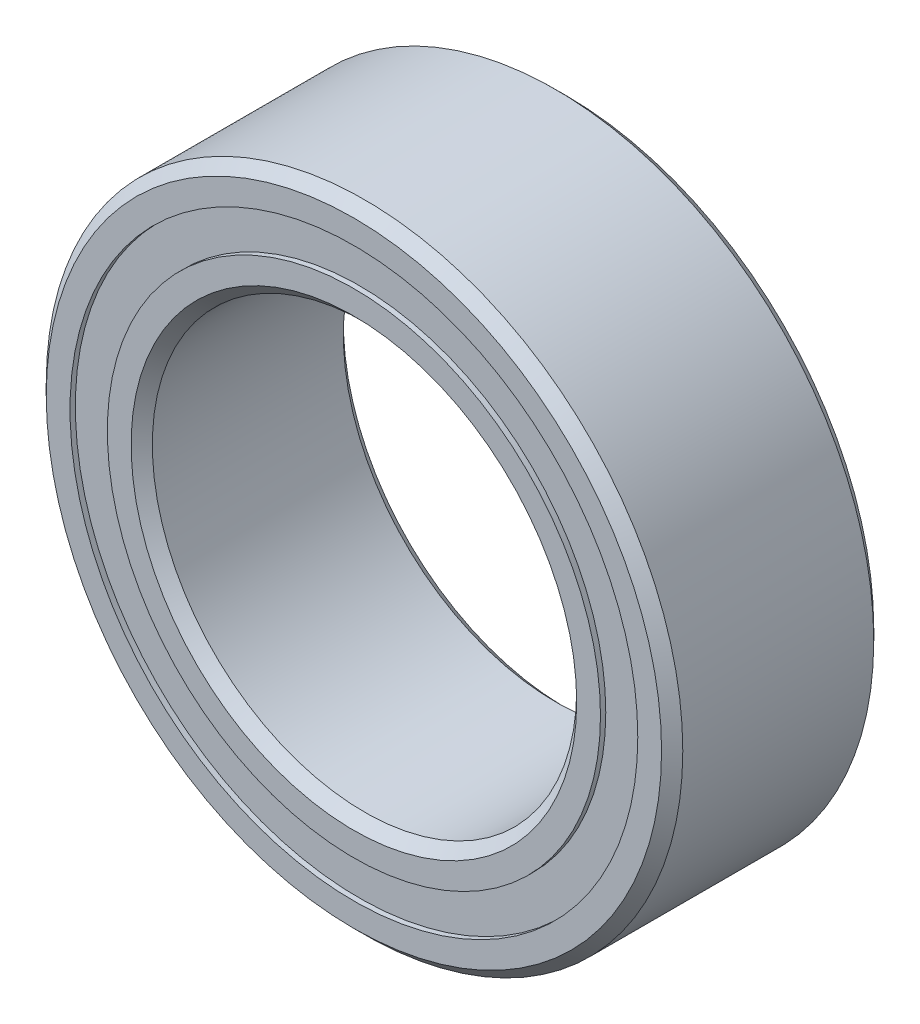
ISO-10303-21;
HEADER;
FILE_DESCRIPTION(('STEP AP214'),'2;1');
FILE_NAME('part.step','',(''),(''),'','','');
FILE_SCHEMA(('AUTOMOTIVE_DESIGN { 1 0 10303 214 1 1 1 1 }'));
ENDSEC;
DATA;
#1=APPLICATION_CONTEXT('core data for automotive mechanical design processes');
#2=APPLICATION_PROTOCOL_DEFINITION('international standard','automotive_design',2000,#1);
#3=PRODUCT_CONTEXT('',#1,'mechanical');
#4=PRODUCT('Part','Part','',(#3));
#5=PRODUCT_RELATED_PRODUCT_CATEGORY('part','',(#4));
#6=PRODUCT_DEFINITION_FORMATION('','',#4);
#7=PRODUCT_DEFINITION_CONTEXT('part definition',#1,'design');
#8=PRODUCT_DEFINITION('design','',#6,#7);
#9=PRODUCT_DEFINITION_SHAPE('','',#8);
#10=(LENGTH_UNIT() NAMED_UNIT(*) SI_UNIT(.MILLI.,.METRE.));
#11=(NAMED_UNIT(*) PLANE_ANGLE_UNIT() SI_UNIT($,.RADIAN.));
#12=(NAMED_UNIT(*) SI_UNIT($,.STERADIAN.) SOLID_ANGLE_UNIT());
#13=UNCERTAINTY_MEASURE_WITH_UNIT(LENGTH_MEASURE(1.E-05),#10,'distance_accuracy_value','');
#14=(GEOMETRIC_REPRESENTATION_CONTEXT(3) GLOBAL_UNCERTAINTY_ASSIGNED_CONTEXT((#13)) GLOBAL_UNIT_ASSIGNED_CONTEXT((#10,
#11,#12)) REPRESENTATION_CONTEXT('',''));
#15=CARTESIAN_POINT('',(0.,0.,0.));
#16=DIRECTION('',(0.,0.,1.));
#17=DIRECTION('',(1.,0.,0.));
#18=AXIS2_PLACEMENT_3D('',#15,#16,#17);
#19=CARTESIAN_POINT('',(0.,4.24787087912088,-1.508125));
#20=DIRECTION('',(0.,0.,1.));
#21=DIRECTION('',(1.,0.,0.));
#22=AXIS2_PLACEMENT_3D('',#19,#20,#21);
#23=PLANE('',#22);
#24=CARTESIAN_POINT('',(0.,0.,-1.508125));
#25=DIRECTION('',(0.,0.,1.));
#26=DIRECTION('',(1.,0.,0.));
#27=AXIS2_PLACEMENT_3D('',#24,#25,#26);
#28=CIRCLE('',#27,4.24787087912088);
#29=CARTESIAN_POINT('',(4.24787087912088,0.,-1.508125));
#30=VERTEX_POINT('',#29);
#31=EDGE_CURVE('E69',#30,#30,#28,.T.);
#32=ORIENTED_EDGE('',*,*,#31,.F.);
#33=EDGE_LOOP('',(#32));
#34=FACE_BOUND('',#33,.T.);
#35=CARTESIAN_POINT('',(0.,0.,-1.508125));
#36=DIRECTION('',(0.,0.,1.));
#37=DIRECTION('',(1.,0.,0.));
#38=AXIS2_PLACEMENT_3D('',#35,#36,#37);
#39=CIRCLE('',#38,3.68962912087912);
#40=CARTESIAN_POINT('',(3.68962912087912,0.,-1.508125));
#41=VERTEX_POINT('',#40);
#42=EDGE_CURVE('E11',#41,#41,#39,.T.);
#43=ORIENTED_EDGE('',*,*,#42,.T.);
#44=EDGE_LOOP('',(#43));
#45=FACE_BOUND('',#44,.T.);
#46=ADVANCED_FACE('F50',(#34,#45),#23,.F.);
#47=CARTESIAN_POINT('',(0.,0.,1.5875));
#48=DIRECTION('',(0.,0.,1.));
#49=DIRECTION('',(1.,0.,0.));
#50=AXIS2_PLACEMENT_3D('',#47,#48,#49);
#51=CYLINDRICAL_SURFACE('',#50,3.68962912087912);
#52=ORIENTED_EDGE('',*,*,#42,.F.);
#53=EDGE_LOOP('',(#52));
#54=FACE_BOUND('',#53,.T.);
#55=CARTESIAN_POINT('',(0.,0.,-0.758760243513405));
#56=DIRECTION('',(0.,0.,1.));
#57=DIRECTION('',(1.,0.,0.));
#58=AXIS2_PLACEMENT_3D('',#55,#56,#57);
#59=CIRCLE('',#58,3.68962912087912);
#60=CARTESIAN_POINT('',(3.68962912087912,0.,-0.758760243513405));
#61=VERTEX_POINT('',#60);
#62=EDGE_CURVE('E57',#61,#61,#59,.T.);
#63=ORIENTED_EDGE('',*,*,#62,.T.);
#64=EDGE_LOOP('',(#63));
#65=FACE_BOUND('',#64,.T.);
#66=ADVANCED_FACE('F80',(#54,#65),#51,.F.);
#67=CARTESIAN_POINT('',(0.,4.24787087912088,-0.758760243513405));
#68=DIRECTION('',(0.,0.,-1.));
#69=DIRECTION('',(-1.,0.,0.));
#70=AXIS2_PLACEMENT_3D('',#67,#68,#69);
#71=PLANE('',#70);
#72=ORIENTED_EDGE('',*,*,#62,.F.);
#73=EDGE_LOOP('',(#72));
#74=FACE_BOUND('',#73,.T.);
#75=CARTESIAN_POINT('',(0.,0.,-0.758760243513405));
#76=DIRECTION('',(0.,0.,1.));
#77=DIRECTION('',(1.,0.,0.));
#78=AXIS2_PLACEMENT_3D('',#75,#76,#77);
#79=CIRCLE('',#78,4.24787087912088);
#80=CARTESIAN_POINT('',(4.24787087912088,0.,-0.758760243513405));
#81=VERTEX_POINT('',#80);
#82=EDGE_CURVE('E63',#81,#81,#79,.T.);
#83=ORIENTED_EDGE('',*,*,#82,.T.);
#84=EDGE_LOOP('',(#83));
#85=FACE_BOUND('',#84,.T.);
#86=ADVANCED_FACE('F84',(#74,#85),#71,.F.);
#87=CARTESIAN_POINT('',(0.,0.,1.5875));
#88=DIRECTION('',(0.,0.,1.));
#89=DIRECTION('',(1.,0.,0.));
#90=AXIS2_PLACEMENT_3D('',#87,#88,#89);
#91=CYLINDRICAL_SURFACE('',#90,4.24787087912088);
#92=ORIENTED_EDGE('',*,*,#82,.F.);
#93=EDGE_LOOP('',(#92));
#94=FACE_BOUND('',#93,.T.);
#95=ORIENTED_EDGE('',*,*,#31,.T.);
#96=EDGE_LOOP('',(#95));
#97=FACE_BOUND('',#96,.T.);
#98=ADVANCED_FACE('F77',(#94,#97),#91,.T.);
#99=CLOSED_SHELL('',(#46,#66,#86,#98));
#100=MANIFOLD_SOLID_BREP('B2',#99);
#101=CARTESIAN_POINT('',(0.,4.24787087912088,1.508125));
#102=DIRECTION('',(0.,0.,-1.));
#103=DIRECTION('',(-1.,0.,0.));
#104=AXIS2_PLACEMENT_3D('',#101,#102,#103);
#105=PLANE('',#104);
#106=CARTESIAN_POINT('',(0.,0.,1.508125));
#107=DIRECTION('',(0.,0.,1.));
#108=DIRECTION('',(1.,0.,0.));
#109=AXIS2_PLACEMENT_3D('',#106,#107,#108);
#110=CIRCLE('',#109,3.68962912087912);
#111=CARTESIAN_POINT('',(3.68962912087912,0.,1.508125));
#112=VERTEX_POINT('',#111);
#113=EDGE_CURVE('E49',#112,#112,#110,.T.);
#114=ORIENTED_EDGE('',*,*,#113,.F.);
#115=EDGE_LOOP('',(#114));
#116=FACE_BOUND('',#115,.T.);
#117=CARTESIAN_POINT('',(0.,0.,1.508125));
#118=DIRECTION('',(0.,0.,1.));
#119=DIRECTION('',(1.,0.,0.));
#120=AXIS2_PLACEMENT_3D('',#117,#118,#119);
#121=CIRCLE('',#120,4.24787087912088);
#122=CARTESIAN_POINT('',(4.24787087912088,0.,1.508125));
#123=VERTEX_POINT('',#122);
#124=EDGE_CURVE('E145',#123,#123,#121,.T.);
#125=ORIENTED_EDGE('',*,*,#124,.T.);
#126=EDGE_LOOP('',(#125));
#127=FACE_BOUND('',#126,.T.);
#128=ADVANCED_FACE('F126',(#116,#127),#105,.F.);
#129=CARTESIAN_POINT('',(0.,0.,1.5875));
#130=DIRECTION('',(0.,0.,1.));
#131=DIRECTION('',(1.,0.,0.));
#132=AXIS2_PLACEMENT_3D('',#129,#130,#131);
#133=CYLINDRICAL_SURFACE('',#132,3.68962912087912);
#134=CARTESIAN_POINT('',(0.,0.,0.758760243513404));
#135=DIRECTION('',(0.,0.,1.));
#136=DIRECTION('',(1.,0.,0.));
#137=AXIS2_PLACEMENT_3D('',#134,#135,#136);
#138=CIRCLE('',#137,3.68962912087912);
#139=CARTESIAN_POINT('',(3.68962912087912,0.,0.758760243513404));
#140=VERTEX_POINT('',#139);
#141=EDGE_CURVE('E133',#140,#140,#138,.T.);
#142=ORIENTED_EDGE('',*,*,#141,.F.);
#143=EDGE_LOOP('',(#142));
#144=FACE_BOUND('',#143,.T.);
#145=ORIENTED_EDGE('',*,*,#113,.T.);
#146=EDGE_LOOP('',(#145));
#147=FACE_BOUND('',#146,.T.);
#148=ADVANCED_FACE('F162',(#144,#147),#133,.F.);
#149=CARTESIAN_POINT('',(0.,4.24787087912088,0.758760243513404));
#150=DIRECTION('',(0.,0.,1.));
#151=DIRECTION('',(1.,0.,0.));
#152=AXIS2_PLACEMENT_3D('',#149,#150,#151);
#153=PLANE('',#152);
#154=CARTESIAN_POINT('',(0.,0.,0.758760243513404));
#155=DIRECTION('',(0.,0.,1.));
#156=DIRECTION('',(1.,0.,0.));
#157=AXIS2_PLACEMENT_3D('',#154,#155,#156);
#158=CIRCLE('',#157,4.24787087912088);
#159=CARTESIAN_POINT('',(4.24787087912088,0.,0.758760243513404));
#160=VERTEX_POINT('',#159);
#161=EDGE_CURVE('E139',#160,#160,#158,.T.);
#162=ORIENTED_EDGE('',*,*,#161,.F.);
#163=EDGE_LOOP('',(#162));
#164=FACE_BOUND('',#163,.T.);
#165=ORIENTED_EDGE('',*,*,#141,.T.);
#166=EDGE_LOOP('',(#165));
#167=FACE_BOUND('',#166,.T.);
#168=ADVANCED_FACE('F157',(#164,#167),#153,.F.);
#169=CARTESIAN_POINT('',(0.,0.,1.5875));
#170=DIRECTION('',(0.,0.,1.));
#171=DIRECTION('',(1.,0.,0.));
#172=AXIS2_PLACEMENT_3D('',#169,#170,#171);
#173=CYLINDRICAL_SURFACE('',#172,4.24787087912088);
#174=ORIENTED_EDGE('',*,*,#124,.F.);
#175=EDGE_LOOP('',(#174));
#176=FACE_BOUND('',#175,.T.);
#177=ORIENTED_EDGE('',*,*,#161,.T.);
#178=EDGE_LOOP('',(#177));
#179=FACE_BOUND('',#178,.T.);
#180=ADVANCED_FACE('F154',(#176,#179),#173,.T.);
#181=CLOSED_SHELL('',(#128,#148,#168,#180));
#182=MANIFOLD_SOLID_BREP('B6',#181);
#183=CARTESIAN_POINT('',(-1.98437499999996,3.43703832126952,0.));
#184=DIRECTION('',(0.,0.,1.));
#185=DIRECTION('',(-0.499999999999989,0.866025403784445,0.));
#186=AXIS2_PLACEMENT_3D('',#183,#184,#185);
#187=SPHERICAL_SURFACE('',#186,0.758760243513404);
#188=CARTESIAN_POINT('',(-1.98437499999996,3.43703832126952,0.758760243513404));
#189=VERTEX_POINT('',#188);
#190=VERTEX_LOOP('',#189);
#191=FACE_BOUND('',#190,.T.);
#192=ADVANCED_FACE('F202',(#191),#187,.T.);
#193=CLOSED_SHELL('',(#192));
#194=MANIFOLD_SOLID_BREP('B44',#193);
#195=CARTESIAN_POINT('',(-3.43703832126947,1.98437500000004,0.));
#196=DIRECTION('',(0.,0.,1.));
#197=DIRECTION('',(-0.866025403784433,0.50000000000001,0.));
#198=AXIS2_PLACEMENT_3D('',#195,#196,#197);
#199=SPHERICAL_SURFACE('',#198,0.758760243513404);
#200=CARTESIAN_POINT('',(-3.43703832126947,1.98437500000004,0.758760243513404));
#201=VERTEX_POINT('',#200);
#202=VERTEX_LOOP('',#201);
#203=FACE_BOUND('',#202,.T.);
#204=ADVANCED_FACE('F223',(#203),#199,.T.);
#205=CLOSED_SHELL('',(#204));
#206=MANIFOLD_SOLID_BREP('B122',#205);
#207=CARTESIAN_POINT('',(-3.96875,0.,0.));
#208=DIRECTION('',(0.,0.,1.));
#209=DIRECTION('',(-1.,0.,0.));
#210=AXIS2_PLACEMENT_3D('',#207,#208,#209);
#211=SPHERICAL_SURFACE('',#210,0.758760243513404);
#212=CARTESIAN_POINT('',(-3.96875,0.,0.758760243513404));
#213=VERTEX_POINT('',#212);
#214=VERTEX_LOOP('',#213);
#215=FACE_BOUND('',#214,.T.);
#216=ADVANCED_FACE('F244',(#215),#211,.T.);
#217=CLOSED_SHELL('',(#216));
#218=MANIFOLD_SOLID_BREP('B198',#217);
#219=CARTESIAN_POINT('',(-3.43703832126951,-1.98437499999997,0.));
#220=DIRECTION('',(0.,0.,1.));
#221=DIRECTION('',(-0.866025403784443,-0.499999999999992,0.));
#222=AXIS2_PLACEMENT_3D('',#219,#220,#221);
#223=SPHERICAL_SURFACE('',#222,0.758760243513404);
#224=CARTESIAN_POINT('',(-3.43703832126951,-1.98437499999997,0.758760243513404));
#225=VERTEX_POINT('',#224);
#226=VERTEX_LOOP('',#225);
#227=FACE_BOUND('',#226,.T.);
#228=ADVANCED_FACE('F265',(#227),#223,.T.);
#229=CLOSED_SHELL('',(#228));
#230=MANIFOLD_SOLID_BREP('B219',#229);
#231=CARTESIAN_POINT('',(-1.98437500000003,-3.43703832126947,0.));
#232=DIRECTION('',(0.,0.,1.));
#233=DIRECTION('',(-0.500000000000007,-0.866025403784435,0.));
#234=AXIS2_PLACEMENT_3D('',#231,#232,#233);
#235=SPHERICAL_SURFACE('',#234,0.758760243513404);
#236=CARTESIAN_POINT('',(-1.98437500000003,-3.43703832126947,0.758760243513404));
#237=VERTEX_POINT('',#236);
#238=VERTEX_LOOP('',#237);
#239=FACE_BOUND('',#238,.T.);
#240=ADVANCED_FACE('F286',(#239),#235,.T.);
#241=CLOSED_SHELL('',(#240));
#242=MANIFOLD_SOLID_BREP('B240',#241);
#243=CARTESIAN_POINT('',(0.,-3.96875,0.));
#244=DIRECTION('',(0.,0.,1.));
#245=DIRECTION('',(0.,-1.,0.));
#246=AXIS2_PLACEMENT_3D('',#243,#244,#245);
#247=SPHERICAL_SURFACE('',#246,0.758760243513404);
#248=CARTESIAN_POINT('',(0.,-3.96875,0.758760243513404));
#249=VERTEX_POINT('',#248);
#250=VERTEX_LOOP('',#249);
#251=FACE_BOUND('',#250,.T.);
#252=ADVANCED_FACE('F307',(#251),#247,.T.);
#253=CLOSED_SHELL('',(#252));
#254=MANIFOLD_SOLID_BREP('B261',#253);
#255=CARTESIAN_POINT('',(1.98437499999998,-3.4370383212695,0.));
#256=DIRECTION('',(0.,0.,1.));
#257=DIRECTION('',(0.499999999999995,-0.866025403784442,0.));
#258=AXIS2_PLACEMENT_3D('',#255,#256,#257);
#259=SPHERICAL_SURFACE('',#258,0.758760243513404);
#260=CARTESIAN_POINT('',(1.98437499999998,-3.4370383212695,0.758760243513404));
#261=VERTEX_POINT('',#260);
#262=VERTEX_LOOP('',#261);
#263=FACE_BOUND('',#262,.T.);
#264=ADVANCED_FACE('F328',(#263),#259,.T.);
#265=CLOSED_SHELL('',(#264));
#266=MANIFOLD_SOLID_BREP('B282',#265);
#267=CARTESIAN_POINT('',(3.43703832126948,-1.98437500000002,0.));
#268=DIRECTION('',(0.,0.,1.));
#269=DIRECTION('',(0.866025403784436,-0.500000000000004,0.));
#270=AXIS2_PLACEMENT_3D('',#267,#268,#269);
#271=SPHERICAL_SURFACE('',#270,0.758760243513404);
#272=CARTESIAN_POINT('',(3.43703832126948,-1.98437500000002,0.758760243513404));
#273=VERTEX_POINT('',#272);
#274=VERTEX_LOOP('',#273);
#275=FACE_BOUND('',#274,.T.);
#276=ADVANCED_FACE('F349',(#275),#271,.T.);
#277=CLOSED_SHELL('',(#276));
#278=MANIFOLD_SOLID_BREP('B303',#277);
#279=CARTESIAN_POINT('',(3.96875,0.,0.));
#280=DIRECTION('',(0.,0.,1.));
#281=DIRECTION('',(1.,0.,0.));
#282=AXIS2_PLACEMENT_3D('',#279,#280,#281);
#283=SPHERICAL_SURFACE('',#282,0.758760243513404);
#284=CARTESIAN_POINT('',(3.96875,0.,0.758760243513404));
#285=VERTEX_POINT('',#284);
#286=VERTEX_LOOP('',#285);
#287=FACE_BOUND('',#286,.T.);
#288=ADVANCED_FACE('F370',(#287),#283,.T.);
#289=CLOSED_SHELL('',(#288));
#290=MANIFOLD_SOLID_BREP('B324',#289);
#291=CARTESIAN_POINT('',(3.4370383212695,1.98437499999999,0.));
#292=DIRECTION('',(0.,0.,1.));
#293=DIRECTION('',(0.86602540378444,0.499999999999998,0.));
#294=AXIS2_PLACEMENT_3D('',#291,#292,#293);
#295=SPHERICAL_SURFACE('',#294,0.758760243513404);
#296=CARTESIAN_POINT('',(3.4370383212695,1.98437499999999,0.758760243513404));
#297=VERTEX_POINT('',#296);
#298=VERTEX_LOOP('',#297);
#299=FACE_BOUND('',#298,.T.);
#300=ADVANCED_FACE('F391',(#299),#295,.T.);
#301=CLOSED_SHELL('',(#300));
#302=MANIFOLD_SOLID_BREP('B345',#301);
#303=CARTESIAN_POINT('',(1.984375,3.43703832126949,0.));
#304=DIRECTION('',(0.,0.,1.));
#305=DIRECTION('',(0.500000000000001,0.866025403784438,0.));
#306=AXIS2_PLACEMENT_3D('',#303,#304,#305);
#307=SPHERICAL_SURFACE('',#306,0.758760243513404);
#308=CARTESIAN_POINT('',(1.984375,3.43703832126949,0.758760243513404));
#309=VERTEX_POINT('',#308);
#310=VERTEX_LOOP('',#309);
#311=FACE_BOUND('',#310,.T.);
#312=ADVANCED_FACE('F412',(#311),#307,.T.);
#313=CLOSED_SHELL('',(#312));
#314=MANIFOLD_SOLID_BREP('B366',#313);
#315=CARTESIAN_POINT('',(0.,3.96875,0.));
#316=DIRECTION('',(0.,0.,1.));
#317=DIRECTION('',(0.,1.,0.));
#318=AXIS2_PLACEMENT_3D('',#315,#316,#317);
#319=SPHERICAL_SURFACE('',#318,0.758760243513404);
#320=CARTESIAN_POINT('',(0.,3.96875,0.758760243513404));
#321=VERTEX_POINT('',#320);
#322=VERTEX_LOOP('',#321);
#323=FACE_BOUND('',#322,.T.);
#324=ADVANCED_FACE('F435',(#323),#319,.T.);
#325=CLOSED_SHELL('',(#324));
#326=MANIFOLD_SOLID_BREP('B387',#325);
#327=CARTESIAN_POINT('',(0.,3.68962912087912,1.5875));
#328=DIRECTION('',(0.,0.,-1.));
#329=DIRECTION('',(-1.,0.,0.));
#330=AXIS2_PLACEMENT_3D('',#327,#328,#329);
#331=PLANE('',#330);
#332=CARTESIAN_POINT('',(0.,0.,1.5875));
#333=DIRECTION('',(0.,0.,1.));
#334=DIRECTION('',(1.,0.,0.));
#335=AXIS2_PLACEMENT_3D('',#332,#333,#334);
#336=CIRCLE('',#335,3.33375);
#337=CARTESIAN_POINT('',(3.33375,0.,1.5875));
#338=VERTEX_POINT('',#337);
#339=EDGE_CURVE('E492',#338,#338,#336,.T.);
#340=ORIENTED_EDGE('',*,*,#339,.F.);
#341=EDGE_LOOP('',(#340));
#342=FACE_BOUND('',#341,.T.);
#343=CARTESIAN_POINT('',(0.,0.,1.5875));
#344=DIRECTION('',(0.,0.,1.));
#345=DIRECTION('',(1.,0.,0.));
#346=AXIS2_PLACEMENT_3D('',#343,#344,#345);
#347=CIRCLE('',#346,3.68962912087912);
#348=CARTESIAN_POINT('',(3.68962912087912,0.,1.5875));
#349=VERTEX_POINT('',#348);
#350=EDGE_CURVE('E434',#349,#349,#347,.T.);
#351=ORIENTED_EDGE('',*,*,#350,.T.);
#352=EDGE_LOOP('',(#351));
#353=FACE_BOUND('',#352,.T.);
#354=ADVANCED_FACE('F455',(#342,#353),#331,.F.);
#355=CARTESIAN_POINT('',(0.,0.,1.5875));
#356=DIRECTION('',(0.,0.,1.));
#357=DIRECTION('',(1.,0.,0.));
#358=AXIS2_PLACEMENT_3D('',#355,#356,#357);
#359=CYLINDRICAL_SURFACE('',#358,3.68962912087912);
#360=ORIENTED_EDGE('',*,*,#350,.F.);
#361=EDGE_LOOP('',(#360));
#362=FACE_BOUND('',#361,.T.);
#363=CARTESIAN_POINT('',(0.,0.,0.705555555555556));
#364=DIRECTION('',(0.,0.,1.));
#365=DIRECTION('',(1.,0.,0.));
#366=AXIS2_PLACEMENT_3D('',#363,#364,#365);
#367=CIRCLE('',#366,3.68962912087912);
#368=CARTESIAN_POINT('',(3.68962912087912,0.,0.705555555555556));
#369=VERTEX_POINT('',#368);
#370=EDGE_CURVE('E462',#369,#369,#367,.T.);
#371=ORIENTED_EDGE('',*,*,#370,.T.);
#372=EDGE_LOOP('',(#371));
#373=FACE_BOUND('',#372,.T.);
#374=ADVANCED_FACE('F501',(#362,#373),#359,.T.);
#375=CARTESIAN_POINT('',(0.,0.,0.));
#376=DIRECTION('',(0.,0.,1.));
#377=DIRECTION('',(1.,0.,0.));
#378=AXIS2_PLACEMENT_3D('',#375,#376,#377);
#379=TOROIDAL_SURFACE('',#378,3.96874999999999,0.758760243513403);
#380=ORIENTED_EDGE('',*,*,#370,.F.);
#381=EDGE_LOOP('',(#380));
#382=FACE_BOUND('',#381,.T.);
#383=CARTESIAN_POINT('',(0.,0.,-0.705555555555557));
#384=DIRECTION('',(0.,0.,1.));
#385=DIRECTION('',(1.,0.,0.));
#386=AXIS2_PLACEMENT_3D('',#383,#384,#385);
#387=CIRCLE('',#386,3.68962912087912);
#388=CARTESIAN_POINT('',(3.68962912087912,0.,-0.705555555555557));
#389=VERTEX_POINT('',#388);
#390=EDGE_CURVE('E468',#389,#389,#387,.T.);
#391=ORIENTED_EDGE('',*,*,#390,.T.);
#392=EDGE_LOOP('',(#391));
#393=FACE_BOUND('',#392,.T.);
#394=ADVANCED_FACE('F505',(#382,#393),#379,.F.);
#395=CARTESIAN_POINT('',(0.,0.,1.5875));
#396=DIRECTION('',(0.,0.,1.));
#397=DIRECTION('',(1.,0.,0.));
#398=AXIS2_PLACEMENT_3D('',#395,#396,#397);
#399=CYLINDRICAL_SURFACE('',#398,3.68962912087912);
#400=ORIENTED_EDGE('',*,*,#390,.F.);
#401=EDGE_LOOP('',(#400));
#402=FACE_BOUND('',#401,.T.);
#403=CARTESIAN_POINT('',(0.,0.,-1.5875));
#404=DIRECTION('',(0.,0.,1.));
#405=DIRECTION('',(1.,0.,0.));
#406=AXIS2_PLACEMENT_3D('',#403,#404,#405);
#407=CIRCLE('',#406,3.68962912087912);
#408=CARTESIAN_POINT('',(3.68962912087912,0.,-1.5875));
#409=VERTEX_POINT('',#408);
#410=EDGE_CURVE('E474',#409,#409,#407,.T.);
#411=ORIENTED_EDGE('',*,*,#410,.T.);
#412=EDGE_LOOP('',(#411));
#413=FACE_BOUND('',#412,.T.);
#414=ADVANCED_FACE('F510',(#402,#413),#399,.T.);
#415=CARTESIAN_POINT('',(0.,3.33375,-1.5875));
#416=DIRECTION('',(0.,0.,1.));
#417=DIRECTION('',(1.,0.,0.));
#418=AXIS2_PLACEMENT_3D('',#415,#416,#417);
#419=PLANE('',#418);
#420=ORIENTED_EDGE('',*,*,#410,.F.);
#421=EDGE_LOOP('',(#420));
#422=FACE_BOUND('',#421,.T.);
#423=CARTESIAN_POINT('',(0.,0.,-1.5875));
#424=DIRECTION('',(0.,0.,1.));
#425=DIRECTION('',(1.,0.,0.));
#426=AXIS2_PLACEMENT_3D('',#423,#424,#425);
#427=CIRCLE('',#426,3.33375);
#428=CARTESIAN_POINT('',(3.33375,0.,-1.5875));
#429=VERTEX_POINT('',#428);
#430=EDGE_CURVE('E480',#429,#429,#427,.T.);
#431=ORIENTED_EDGE('',*,*,#430,.T.);
#432=EDGE_LOOP('',(#431));
#433=FACE_BOUND('',#432,.T.);
#434=ADVANCED_FACE('F516',(#422,#433),#419,.F.);
#435=CARTESIAN_POINT('',(0.,0.,-1.42875));
#436=DIRECTION('',(0.,0.,-1.));
#437=DIRECTION('',(-1.,0.,0.));
#438=AXIS2_PLACEMENT_3D('',#435,#436,#437);
#439=CONICAL_SURFACE('',#438,3.175,0.785398163397451);
#440=ORIENTED_EDGE('',*,*,#430,.F.);
#441=EDGE_LOOP('',(#440));
#442=FACE_BOUND('',#441,.T.);
#443=CARTESIAN_POINT('',(0.,0.,-1.42875));
#444=DIRECTION('',(0.,0.,1.));
#445=DIRECTION('',(1.,0.,0.));
#446=AXIS2_PLACEMENT_3D('',#443,#444,#445);
#447=CIRCLE('',#446,3.175);
#448=CARTESIAN_POINT('',(3.175,0.,-1.42875));
#449=VERTEX_POINT('',#448);
#450=EDGE_CURVE('E484',#449,#449,#447,.T.);
#451=ORIENTED_EDGE('',*,*,#450,.T.);
#452=EDGE_LOOP('',(#451));
#453=FACE_BOUND('',#452,.T.);
#454=ADVANCED_FACE('F520',(#442,#453),#439,.F.);
#455=CARTESIAN_POINT('',(0.,0.,1.5875));
#456=DIRECTION('',(0.,0.,1.));
#457=DIRECTION('',(1.,0.,0.));
#458=AXIS2_PLACEMENT_3D('',#455,#456,#457);
#459=CYLINDRICAL_SURFACE('',#458,3.175);
#460=ORIENTED_EDGE('',*,*,#450,.F.);
#461=EDGE_LOOP('',(#460));
#462=FACE_BOUND('',#461,.T.);
#463=CARTESIAN_POINT('',(0.,0.,1.42875));
#464=DIRECTION('',(0.,0.,1.));
#465=DIRECTION('',(1.,0.,0.));
#466=AXIS2_PLACEMENT_3D('',#463,#464,#465);
#467=CIRCLE('',#466,3.175);
#468=CARTESIAN_POINT('',(3.175,0.,1.42875));
#469=VERTEX_POINT('',#468);
#470=EDGE_CURVE('E488',#469,#469,#467,.T.);
#471=ORIENTED_EDGE('',*,*,#470,.T.);
#472=EDGE_LOOP('',(#471));
#473=FACE_BOUND('',#472,.T.);
#474=ADVANCED_FACE('F524',(#462,#473),#459,.F.);
#475=CARTESIAN_POINT('',(0.,0.,1.5875));
#476=DIRECTION('',(0.,0.,1.));
#477=DIRECTION('',(1.,0.,0.));
#478=AXIS2_PLACEMENT_3D('',#475,#476,#477);
#479=CONICAL_SURFACE('',#478,3.33375,0.785398163397448);
#480=ORIENTED_EDGE('',*,*,#470,.F.);
#481=EDGE_LOOP('',(#480));
#482=FACE_BOUND('',#481,.T.);
#483=ORIENTED_EDGE('',*,*,#339,.T.);
#484=EDGE_LOOP('',(#483));
#485=FACE_BOUND('',#484,.T.);
#486=ADVANCED_FACE('F498',(#482,#485),#479,.F.);
#487=CLOSED_SHELL('',(#354,#374,#394,#414,#434,#454,#474,#486));
#488=MANIFOLD_SOLID_BREP('B408',#487);
#489=CARTESIAN_POINT('',(0.,0.,1.42875));
#490=DIRECTION('',(0.,0.,-1.));
#491=DIRECTION('',(-1.,0.,0.));
#492=AXIS2_PLACEMENT_3D('',#489,#490,#491);
#493=CONICAL_SURFACE('',#492,4.7625,0.785398163397445);
#494=CARTESIAN_POINT('',(0.,0.,1.5875));
#495=DIRECTION('',(0.,0.,1.));
#496=DIRECTION('',(1.,0.,0.));
#497=AXIS2_PLACEMENT_3D('',#494,#495,#496);
#498=CIRCLE('',#497,4.60375);
#499=CARTESIAN_POINT('',(4.60375,0.,1.5875));
#500=VERTEX_POINT('',#499);
#501=EDGE_CURVE('E630',#500,#500,#498,.T.);
#502=ORIENTED_EDGE('',*,*,#501,.F.);
#503=EDGE_LOOP('',(#502));
#504=FACE_BOUND('',#503,.T.);
#505=CARTESIAN_POINT('',(0.,0.,1.42875));
#506=DIRECTION('',(0.,0.,1.));
#507=DIRECTION('',(1.,0.,0.));
#508=AXIS2_PLACEMENT_3D('',#505,#506,#507);
#509=CIRCLE('',#508,4.7625);
#510=CARTESIAN_POINT('',(4.7625,0.,1.42875));
#511=VERTEX_POINT('',#510);
#512=EDGE_CURVE('E454',#511,#511,#509,.T.);
#513=ORIENTED_EDGE('',*,*,#512,.T.);
#514=EDGE_LOOP('',(#513));
#515=FACE_BOUND('',#514,.T.);
#516=ADVANCED_FACE('F593',(#504,#515),#493,.T.);
#517=CARTESIAN_POINT('',(0.,0.,1.5875));
#518=DIRECTION('',(0.,0.,1.));
#519=DIRECTION('',(1.,0.,0.));
#520=AXIS2_PLACEMENT_3D('',#517,#518,#519);
#521=CYLINDRICAL_SURFACE('',#520,4.7625);
#522=ORIENTED_EDGE('',*,*,#512,.F.);
#523=EDGE_LOOP('',(#522));
#524=FACE_BOUND('',#523,.T.);
#525=CARTESIAN_POINT('',(0.,0.,-1.42875));
#526=DIRECTION('',(0.,0.,1.));
#527=DIRECTION('',(1.,0.,0.));
#528=AXIS2_PLACEMENT_3D('',#525,#526,#527);
#529=CIRCLE('',#528,4.7625);
#530=CARTESIAN_POINT('',(4.7625,0.,-1.42875));
#531=VERTEX_POINT('',#530);
#532=EDGE_CURVE('E600',#531,#531,#529,.T.);
#533=ORIENTED_EDGE('',*,*,#532,.T.);
#534=EDGE_LOOP('',(#533));
#535=FACE_BOUND('',#534,.T.);
#536=ADVANCED_FACE('F639',(#524,#535),#521,.T.);
#537=CARTESIAN_POINT('',(0.,0.,-1.5875));
#538=DIRECTION('',(0.,0.,1.));
#539=DIRECTION('',(1.,0.,0.));
#540=AXIS2_PLACEMENT_3D('',#537,#538,#539);
#541=CONICAL_SURFACE('',#540,4.60375,0.785398163397444);
#542=ORIENTED_EDGE('',*,*,#532,.F.);
#543=EDGE_LOOP('',(#542));
#544=FACE_BOUND('',#543,.T.);
#545=CARTESIAN_POINT('',(0.,0.,-1.5875));
#546=DIRECTION('',(0.,0.,1.));
#547=DIRECTION('',(1.,0.,0.));
#548=AXIS2_PLACEMENT_3D('',#545,#546,#547);
#549=CIRCLE('',#548,4.60375);
#550=CARTESIAN_POINT('',(4.60375,0.,-1.5875));
#551=VERTEX_POINT('',#550);
#552=EDGE_CURVE('E606',#551,#551,#549,.T.);
#553=ORIENTED_EDGE('',*,*,#552,.T.);
#554=EDGE_LOOP('',(#553));
#555=FACE_BOUND('',#554,.T.);
#556=ADVANCED_FACE('F643',(#544,#555),#541,.T.);
#557=CARTESIAN_POINT('',(0.,4.60375,-1.5875));
#558=DIRECTION('',(0.,0.,1.));
#559=DIRECTION('',(1.,0.,0.));
#560=AXIS2_PLACEMENT_3D('',#557,#558,#559);
#561=PLANE('',#560);
#562=ORIENTED_EDGE('',*,*,#552,.F.);
#563=EDGE_LOOP('',(#562));
#564=FACE_BOUND('',#563,.T.);
#565=CARTESIAN_POINT('',(0.,0.,-1.5875));
#566=DIRECTION('',(0.,0.,1.));
#567=DIRECTION('',(1.,0.,0.));
#568=AXIS2_PLACEMENT_3D('',#565,#566,#567);
#569=CIRCLE('',#568,4.24787087912088);
#570=CARTESIAN_POINT('',(4.24787087912088,0.,-1.5875));
#571=VERTEX_POINT('',#570);
#572=EDGE_CURVE('E612',#571,#571,#569,.T.);
#573=ORIENTED_EDGE('',*,*,#572,.T.);
#574=EDGE_LOOP('',(#573));
#575=FACE_BOUND('',#574,.T.);
#576=ADVANCED_FACE('F648',(#564,#575),#561,.F.);
#577=CARTESIAN_POINT('',(0.,0.,1.5875));
#578=DIRECTION('',(0.,0.,1.));
#579=DIRECTION('',(1.,0.,0.));
#580=AXIS2_PLACEMENT_3D('',#577,#578,#579);
#581=CYLINDRICAL_SURFACE('',#580,4.24787087912088);
#582=ORIENTED_EDGE('',*,*,#572,.F.);
#583=EDGE_LOOP('',(#582));
#584=FACE_BOUND('',#583,.T.);
#585=CARTESIAN_POINT('',(0.,0.,-0.705555555555556));
#586=DIRECTION('',(0.,0.,1.));
#587=DIRECTION('',(1.,0.,0.));
#588=AXIS2_PLACEMENT_3D('',#585,#586,#587);
#589=CIRCLE('',#588,4.24787087912088);
#590=CARTESIAN_POINT('',(4.24787087912088,0.,-0.705555555555556));
#591=VERTEX_POINT('',#590);
#592=EDGE_CURVE('E618',#591,#591,#589,.T.);
#593=ORIENTED_EDGE('',*,*,#592,.T.);
#594=EDGE_LOOP('',(#593));
#595=FACE_BOUND('',#594,.T.);
#596=ADVANCED_FACE('F654',(#584,#595),#581,.F.);
#597=CARTESIAN_POINT('',(0.,0.,0.));
#598=DIRECTION('',(0.,0.,1.));
#599=DIRECTION('',(1.,0.,0.));
#600=AXIS2_PLACEMENT_3D('',#597,#598,#599);
#601=TOROIDAL_SURFACE('',#600,3.96875,0.758760243513404);
#602=ORIENTED_EDGE('',*,*,#592,.F.);
#603=EDGE_LOOP('',(#602));
#604=FACE_BOUND('',#603,.T.);
#605=CARTESIAN_POINT('',(0.,0.,0.705555555555555));
#606=DIRECTION('',(0.,0.,1.));
#607=DIRECTION('',(1.,0.,0.));
#608=AXIS2_PLACEMENT_3D('',#605,#606,#607);
#609=CIRCLE('',#608,4.24787087912088);
#610=CARTESIAN_POINT('',(4.24787087912088,0.,0.705555555555555));
#611=VERTEX_POINT('',#610);
#612=EDGE_CURVE('E622',#611,#611,#609,.T.);
#613=ORIENTED_EDGE('',*,*,#612,.T.);
#614=EDGE_LOOP('',(#613));
#615=FACE_BOUND('',#614,.T.);
#616=ADVANCED_FACE('F658',(#604,#615),#601,.F.);
#617=CARTESIAN_POINT('',(0.,0.,1.5875));
#618=DIRECTION('',(0.,0.,1.));
#619=DIRECTION('',(1.,0.,0.));
#620=AXIS2_PLACEMENT_3D('',#617,#618,#619);
#621=CYLINDRICAL_SURFACE('',#620,4.24787087912088);
#622=ORIENTED_EDGE('',*,*,#612,.F.);
#623=EDGE_LOOP('',(#622));
#624=FACE_BOUND('',#623,.T.);
#625=CARTESIAN_POINT('',(0.,0.,1.5875));
#626=DIRECTION('',(0.,0.,1.));
#627=DIRECTION('',(1.,0.,0.));
#628=AXIS2_PLACEMENT_3D('',#625,#626,#627);
#629=CIRCLE('',#628,4.24787087912088);
#630=CARTESIAN_POINT('',(4.24787087912088,0.,1.5875));
#631=VERTEX_POINT('',#630);
#632=EDGE_CURVE('E626',#631,#631,#629,.T.);
#633=ORIENTED_EDGE('',*,*,#632,.T.);
#634=EDGE_LOOP('',(#633));
#635=FACE_BOUND('',#634,.T.);
#636=ADVANCED_FACE('F662',(#624,#635),#621,.F.);
#637=CARTESIAN_POINT('',(0.,4.60375,1.5875));
#638=DIRECTION('',(0.,0.,-1.));
#639=DIRECTION('',(-1.,0.,0.));
#640=AXIS2_PLACEMENT_3D('',#637,#638,#639);
#641=PLANE('',#640);
#642=ORIENTED_EDGE('',*,*,#632,.F.);
#643=EDGE_LOOP('',(#642));
#644=FACE_BOUND('',#643,.T.);
#645=ORIENTED_EDGE('',*,*,#501,.T.);
#646=EDGE_LOOP('',(#645));
#647=FACE_BOUND('',#646,.T.);
#648=ADVANCED_FACE('F636',(#644,#647),#641,.F.);
#649=CLOSED_SHELL('',(#516,#536,#556,#576,#596,#616,#636,#648));
#650=MANIFOLD_SOLID_BREP('B429',#649);
#651=ADVANCED_BREP_SHAPE_REPRESENTATION('',(#18,#100,#182,#194,#206,#218,#230,#242,#254,#266,
#278,#290,#302,#314,#326,#488,#650),#14);
#652=SHAPE_DEFINITION_REPRESENTATION(#9,#651);
ENDSEC;
END-ISO-10303-21;
